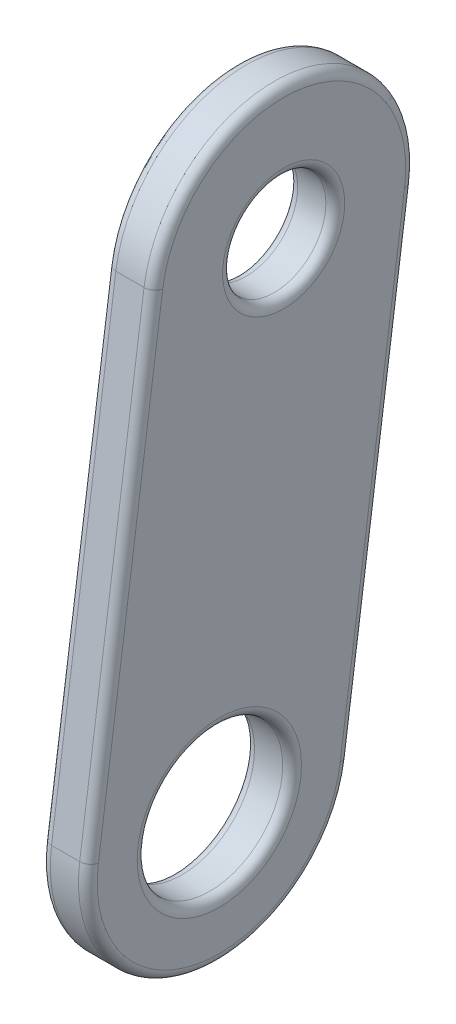
ISO-10303-21;
HEADER;
FILE_DESCRIPTION(('STEP AP214'),'2;1');
FILE_NAME('part.step','',(''),(''),'','','');
FILE_SCHEMA(('AUTOMOTIVE_DESIGN { 1 0 10303 214 1 1 1 1 }'));
ENDSEC;
DATA;
#1=APPLICATION_CONTEXT('core data for automotive mechanical design processes');
#2=APPLICATION_PROTOCOL_DEFINITION('international standard','automotive_design',2000,#1);
#3=PRODUCT_CONTEXT('',#1,'mechanical');
#4=PRODUCT('Part','Part','',(#3));
#5=PRODUCT_RELATED_PRODUCT_CATEGORY('part','',(#4));
#6=PRODUCT_DEFINITION_FORMATION('','',#4);
#7=PRODUCT_DEFINITION_CONTEXT('part definition',#1,'design');
#8=PRODUCT_DEFINITION('design','',#6,#7);
#9=PRODUCT_DEFINITION_SHAPE('','',#8);
#10=(LENGTH_UNIT() NAMED_UNIT(*) SI_UNIT(.MILLI.,.METRE.));
#11=(NAMED_UNIT(*) PLANE_ANGLE_UNIT() SI_UNIT($,.RADIAN.));
#12=(NAMED_UNIT(*) SI_UNIT($,.STERADIAN.) SOLID_ANGLE_UNIT());
#13=UNCERTAINTY_MEASURE_WITH_UNIT(LENGTH_MEASURE(1.E-05),#10,'distance_accuracy_value','');
#14=(GEOMETRIC_REPRESENTATION_CONTEXT(3) GLOBAL_UNCERTAINTY_ASSIGNED_CONTEXT((#13)) GLOBAL_UNIT_ASSIGNED_CONTEXT((#10,
#11,#12)) REPRESENTATION_CONTEXT('',''));
#15=CARTESIAN_POINT('',(0.,0.,0.));
#16=DIRECTION('',(0.,0.,1.));
#17=DIRECTION('',(1.,0.,0.));
#18=AXIS2_PLACEMENT_3D('',#15,#16,#17);
#19=CARTESIAN_POINT('',(2.5,-49.5285523713343,6.85));
#20=DIRECTION('',(-1.,0.,0.));
#21=DIRECTION('',(0.,0.,1.));
#22=AXIS2_PLACEMENT_3D('',#19,#20,#21);
#23=CYLINDRICAL_SURFACE('',#22,14.);
#24=DIRECTION('',(-1.,0.,0.));
#25=VECTOR('',#24,1.);
#26=CARTESIAN_POINT('',(2.5,-47.6105523713343,20.7179946639736));
#27=LINE('',#26,#25);
#28=CARTESIAN_POINT('',(1.5,-47.6105523713343,20.7179946639736));
#29=VERTEX_POINT('',#28);
#30=CARTESIAN_POINT('',(-1.5,-47.6105523713343,20.7179946639736));
#31=VERTEX_POINT('',#30);
#32=EDGE_CURVE('E162',#29,#31,#27,.T.);
#33=ORIENTED_EDGE('',*,*,#32,.T.);
#34=CARTESIAN_POINT('',(-1.5,-49.5285523713343,6.85));
#35=DIRECTION('',(1.,0.,0.));
#36=DIRECTION('',(0.,0.,-1.));
#37=AXIS2_PLACEMENT_3D('',#34,#35,#36);
#38=CIRCLE('',#37,14.);
#39=CARTESIAN_POINT('',(-1.5,-51.4465523713343,-7.0179946639736));
#40=VERTEX_POINT('',#39);
#41=EDGE_CURVE('E128',#31,#40,#38,.T.);
#42=ORIENTED_EDGE('',*,*,#41,.T.);
#43=DIRECTION('',(-1.,0.,0.));
#44=VECTOR('',#43,1.);
#45=CARTESIAN_POINT('',(2.5,-51.4465523713343,-7.0179946639736));
#46=LINE('',#45,#44);
#47=CARTESIAN_POINT('',(1.5,-51.4465523713343,-7.0179946639736));
#48=VERTEX_POINT('',#47);
#49=EDGE_CURVE('E113',#48,#40,#46,.T.);
#50=ORIENTED_EDGE('',*,*,#49,.F.);
#51=CARTESIAN_POINT('',(1.5,-49.5285523713343,6.85));
#52=DIRECTION('',(1.,0.,0.));
#53=DIRECTION('',(0.,0.,-1.));
#54=AXIS2_PLACEMENT_3D('',#51,#52,#53);
#55=CIRCLE('',#54,14.);
#56=EDGE_CURVE('E129',#48,#29,#55,.F.);
#57=ORIENTED_EDGE('',*,*,#56,.T.);
#58=EDGE_LOOP('',(#33,#42,#50,#57));
#59=FACE_BOUND('',#58,.T.);
#60=ADVANCED_FACE('F41',(#59),#23,.T.);
#61=CARTESIAN_POINT('',(2.5,-51.4465523713343,-7.0179946639736));
#62=DIRECTION('',(0.,0.137,0.990571047426685));
#63=DIRECTION('',(0.,-0.990571047426685,0.137));
#64=AXIS2_PLACEMENT_3D('',#61,#62,#63);
#65=PLANE('',#64);
#66=ORIENTED_EDGE('',*,*,#49,.T.);
#67=DIRECTION('',(0.,0.990571047426685,-0.137));
#68=VECTOR('',#67,1.);
#69=CARTESIAN_POINT('',(-1.5,-51.4465523713343,-7.0179946639736));
#70=LINE('',#69,#68);
#71=CARTESIAN_POINT('',(-1.5,-1.918,-13.8679946639736));
#72=VERTEX_POINT('',#71);
#73=EDGE_CURVE('E118',#40,#72,#70,.T.);
#74=ORIENTED_EDGE('',*,*,#73,.T.);
#75=DIRECTION('',(-1.,0.,0.));
#76=VECTOR('',#75,1.);
#77=CARTESIAN_POINT('',(2.5,-1.918,-13.8679946639736));
#78=LINE('',#77,#76);
#79=CARTESIAN_POINT('',(1.5,-1.918,-13.8679946639736));
#80=VERTEX_POINT('',#79);
#81=EDGE_CURVE('E114',#80,#72,#78,.T.);
#82=ORIENTED_EDGE('',*,*,#81,.F.);
#83=DIRECTION('',(0.,0.990571047426685,-0.137));
#84=VECTOR('',#83,1.);
#85=CARTESIAN_POINT('',(1.5,-51.4465523713343,-7.0179946639736));
#86=LINE('',#85,#84);
#87=EDGE_CURVE('E109',#80,#48,#86,.F.);
#88=ORIENTED_EDGE('',*,*,#87,.T.);
#89=EDGE_LOOP('',(#66,#74,#82,#88));
#90=FACE_BOUND('',#89,.T.);
#91=ADVANCED_FACE('F115',(#90),#65,.F.);
#92=CARTESIAN_POINT('',(2.5,0.,0.));
#93=DIRECTION('',(-1.,0.,0.));
#94=DIRECTION('',(0.,0.,1.));
#95=AXIS2_PLACEMENT_3D('',#92,#93,#94);
#96=CYLINDRICAL_SURFACE('',#95,14.);
#97=ORIENTED_EDGE('',*,*,#81,.T.);
#98=CARTESIAN_POINT('',(-1.5,0.,0.));
#99=DIRECTION('',(1.,0.,0.));
#100=DIRECTION('',(0.,0.,-1.));
#101=AXIS2_PLACEMENT_3D('',#98,#99,#100);
#102=CIRCLE('',#101,14.);
#103=CARTESIAN_POINT('',(-1.5,1.918,13.8679946639736));
#104=VERTEX_POINT('',#103);
#105=EDGE_CURVE('E191',#72,#104,#102,.T.);
#106=ORIENTED_EDGE('',*,*,#105,.T.);
#107=DIRECTION('',(-1.,0.,0.));
#108=VECTOR('',#107,1.);
#109=CARTESIAN_POINT('',(2.5,1.918,13.8679946639736));
#110=LINE('',#109,#108);
#111=CARTESIAN_POINT('',(1.5,1.918,13.8679946639736));
#112=VERTEX_POINT('',#111);
#113=EDGE_CURVE('E170',#112,#104,#110,.T.);
#114=ORIENTED_EDGE('',*,*,#113,.F.);
#115=CARTESIAN_POINT('',(1.5,0.,0.));
#116=DIRECTION('',(1.,0.,0.));
#117=DIRECTION('',(0.,0.,-1.));
#118=AXIS2_PLACEMENT_3D('',#115,#116,#117);
#119=CIRCLE('',#118,14.);
#120=EDGE_CURVE('E188',#112,#80,#119,.F.);
#121=ORIENTED_EDGE('',*,*,#120,.T.);
#122=EDGE_LOOP('',(#97,#106,#114,#121));
#123=FACE_BOUND('',#122,.T.);
#124=ADVANCED_FACE('F223',(#123),#96,.T.);
#125=CARTESIAN_POINT('',(2.5,-47.6105523713343,20.7179946639736));
#126=DIRECTION('',(0.,0.137,0.990571047426685));
#127=DIRECTION('',(0.,-0.990571047426685,0.137));
#128=AXIS2_PLACEMENT_3D('',#125,#126,#127);
#129=PLANE('',#128);
#130=ORIENTED_EDGE('',*,*,#113,.T.);
#131=DIRECTION('',(0.,0.990571047426685,-0.137));
#132=VECTOR('',#131,1.);
#133=CARTESIAN_POINT('',(-1.5,-47.6105523713343,20.7179946639736));
#134=LINE('',#133,#132);
#135=EDGE_CURVE('E11',#104,#31,#134,.F.);
#136=ORIENTED_EDGE('',*,*,#135,.T.);
#137=ORIENTED_EDGE('',*,*,#32,.F.);
#138=DIRECTION('',(0.,0.990571047426685,-0.137));
#139=VECTOR('',#138,1.);
#140=CARTESIAN_POINT('',(1.5,-47.6105523713343,20.7179946639736));
#141=LINE('',#140,#139);
#142=EDGE_CURVE('E49',#29,#112,#141,.T.);
#143=ORIENTED_EDGE('',*,*,#142,.T.);
#144=EDGE_LOOP('',(#130,#136,#137,#143));
#145=FACE_BOUND('',#144,.T.);
#146=ADVANCED_FACE('F219',(#145),#129,.T.);
#147=CARTESIAN_POINT('',(2.5,-49.5285523713343,6.85));
#148=DIRECTION('',(1.,0.,0.));
#149=DIRECTION('',(0.,0.,-1.));
#150=AXIS2_PLACEMENT_3D('',#147,#148,#149);
#151=PLANE('',#150);
#152=CARTESIAN_POINT('',(2.5,0.,0.));
#153=DIRECTION('',(1.,0.,0.));
#154=DIRECTION('',(0.,0.,-1.));
#155=AXIS2_PLACEMENT_3D('',#152,#153,#154);
#156=CIRCLE('',#155,6.49999999999999);
#157=CARTESIAN_POINT('',(2.5,0.,-6.49999999999999));
#158=VERTEX_POINT('',#157);
#159=EDGE_CURVE('E204',#158,#158,#156,.F.);
#160=ORIENTED_EDGE('',*,*,#159,.T.);
#161=EDGE_LOOP('',(#160));
#162=FACE_BOUND('',#161,.T.);
#163=CARTESIAN_POINT('',(2.5,-49.5285523713343,6.85));
#164=DIRECTION('',(1.,0.,0.));
#165=DIRECTION('',(0.,0.,-1.));
#166=AXIS2_PLACEMENT_3D('',#163,#164,#165);
#167=CIRCLE('',#166,8.75);
#168=CARTESIAN_POINT('',(2.5,-49.5285523713343,-1.9));
#169=VERTEX_POINT('',#168);
#170=EDGE_CURVE('E202',#169,#169,#167,.F.);
#171=ORIENTED_EDGE('',*,*,#170,.T.);
#172=EDGE_LOOP('',(#171));
#173=FACE_BOUND('',#172,.T.);
#174=DIRECTION('',(0.,0.990571047426685,-0.137));
#175=VECTOR('',#174,1.);
#176=CARTESIAN_POINT('',(2.5,-47.7475523713343,19.7274236165469));
#177=LINE('',#176,#175);
#178=CARTESIAN_POINT('',(2.5,1.781,12.8774236165469));
#179=VERTEX_POINT('',#178);
#180=CARTESIAN_POINT('',(2.5,-47.7475523713343,19.7274236165469));
#181=VERTEX_POINT('',#180);
#182=EDGE_CURVE('E193',#179,#181,#177,.F.);
#183=ORIENTED_EDGE('',*,*,#182,.T.);
#184=CARTESIAN_POINT('',(2.5,-49.5285523713343,6.85));
#185=DIRECTION('',(1.,0.,0.));
#186=DIRECTION('',(0.,0.,-1.));
#187=AXIS2_PLACEMENT_3D('',#184,#185,#186);
#188=CIRCLE('',#187,13.);
#189=CARTESIAN_POINT('',(2.5,-51.3095523713343,-6.02742361654691));
#190=VERTEX_POINT('',#189);
#191=EDGE_CURVE('E197',#181,#190,#188,.T.);
#192=ORIENTED_EDGE('',*,*,#191,.T.);
#193=DIRECTION('',(0.,0.990571047426685,-0.137));
#194=VECTOR('',#193,1.);
#195=CARTESIAN_POINT('',(2.5,-1.78099999999999,-12.8774236165469));
#196=LINE('',#195,#194);
#197=CARTESIAN_POINT('',(2.5,-1.781,-12.8774236165469));
#198=VERTEX_POINT('',#197);
#199=EDGE_CURVE('E62',#190,#198,#196,.T.);
#200=ORIENTED_EDGE('',*,*,#199,.T.);
#201=CARTESIAN_POINT('',(2.5,0.,0.));
#202=DIRECTION('',(1.,0.,0.));
#203=DIRECTION('',(0.,0.,-1.));
#204=AXIS2_PLACEMENT_3D('',#201,#202,#203);
#205=CIRCLE('',#204,13.);
#206=EDGE_CURVE('E196',#198,#179,#205,.T.);
#207=ORIENTED_EDGE('',*,*,#206,.T.);
#208=EDGE_LOOP('',(#183,#192,#200,#207));
#209=FACE_BOUND('',#208,.T.);
#210=ADVANCED_FACE('F227',(#162,#173,#209),#151,.T.);
#211=CARTESIAN_POINT('',(-2.5,-49.5285523713343,6.85));
#212=DIRECTION('',(1.,0.,0.));
#213=DIRECTION('',(0.,0.,-1.));
#214=AXIS2_PLACEMENT_3D('',#211,#212,#213);
#215=PLANE('',#214);
#216=CARTESIAN_POINT('',(-2.5,0.,0.));
#217=DIRECTION('',(1.,0.,0.));
#218=DIRECTION('',(0.,0.,-1.));
#219=AXIS2_PLACEMENT_3D('',#216,#217,#218);
#220=CIRCLE('',#219,6.49999999999999);
#221=CARTESIAN_POINT('',(-2.5,0.,-6.49999999999999));
#222=VERTEX_POINT('',#221);
#223=EDGE_CURVE('E119',#222,#222,#220,.T.);
#224=ORIENTED_EDGE('',*,*,#223,.T.);
#225=EDGE_LOOP('',(#224));
#226=FACE_BOUND('',#225,.T.);
#227=CARTESIAN_POINT('',(-2.5,-49.5285523713343,6.85));
#228=DIRECTION('',(1.,0.,0.));
#229=DIRECTION('',(0.,0.,-1.));
#230=AXIS2_PLACEMENT_3D('',#227,#228,#229);
#231=CIRCLE('',#230,8.75);
#232=CARTESIAN_POINT('',(-2.5,-49.5285523713343,-1.9));
#233=VERTEX_POINT('',#232);
#234=EDGE_CURVE('E183',#233,#233,#231,.T.);
#235=ORIENTED_EDGE('',*,*,#234,.T.);
#236=EDGE_LOOP('',(#235));
#237=FACE_BOUND('',#236,.T.);
#238=DIRECTION('',(0.,0.990571047426685,-0.137));
#239=VECTOR('',#238,1.);
#240=CARTESIAN_POINT('',(-2.5,-51.3095523713343,-6.02742361654691));
#241=LINE('',#240,#239);
#242=CARTESIAN_POINT('',(-2.5,-1.781,-12.8774236165469));
#243=VERTEX_POINT('',#242);
#244=CARTESIAN_POINT('',(-2.5,-51.3095523713343,-6.02742361654691));
#245=VERTEX_POINT('',#244);
#246=EDGE_CURVE('E177',#243,#245,#241,.F.);
#247=ORIENTED_EDGE('',*,*,#246,.T.);
#248=CARTESIAN_POINT('',(-2.5,-49.5285523713343,6.85));
#249=DIRECTION('',(1.,0.,0.));
#250=DIRECTION('',(0.,0.,-1.));
#251=AXIS2_PLACEMENT_3D('',#248,#249,#250);
#252=CIRCLE('',#251,13.);
#253=CARTESIAN_POINT('',(-2.5,-47.7475523713343,19.7274236165469));
#254=VERTEX_POINT('',#253);
#255=EDGE_CURVE('E181',#245,#254,#252,.F.);
#256=ORIENTED_EDGE('',*,*,#255,.T.);
#257=DIRECTION('',(0.,0.990571047426685,-0.137));
#258=VECTOR('',#257,1.);
#259=CARTESIAN_POINT('',(-2.5,1.781,12.8774236165469));
#260=LINE('',#259,#258);
#261=CARTESIAN_POINT('',(-2.5,1.781,12.8774236165469));
#262=VERTEX_POINT('',#261);
#263=EDGE_CURVE('E174',#254,#262,#260,.T.);
#264=ORIENTED_EDGE('',*,*,#263,.T.);
#265=CARTESIAN_POINT('',(-2.5,0.,0.));
#266=DIRECTION('',(1.,0.,0.));
#267=DIRECTION('',(0.,0.,-1.));
#268=AXIS2_PLACEMENT_3D('',#265,#266,#267);
#269=CIRCLE('',#268,13.);
#270=EDGE_CURVE('E180',#262,#243,#269,.F.);
#271=ORIENTED_EDGE('',*,*,#270,.T.);
#272=EDGE_LOOP('',(#247,#256,#264,#271));
#273=FACE_BOUND('',#272,.T.);
#274=ADVANCED_FACE('F288',(#226,#237,#273),#215,.F.);
#275=CARTESIAN_POINT('',(2.5,-49.5285523713343,6.85));
#276=DIRECTION('',(1.,0.,0.));
#277=DIRECTION('',(0.,0.,-1.));
#278=AXIS2_PLACEMENT_3D('',#275,#276,#277);
#279=CYLINDRICAL_SURFACE('',#278,7.75);
#280=CARTESIAN_POINT('',(1.5,-49.5285523713343,6.85));
#281=DIRECTION('',(1.,0.,0.));
#282=DIRECTION('',(0.,0.,-1.));
#283=AXIS2_PLACEMENT_3D('',#280,#281,#282);
#284=CIRCLE('',#283,7.75);
#285=CARTESIAN_POINT('',(1.5,-49.5285523713343,-0.900000000000001));
#286=VERTEX_POINT('',#285);
#287=EDGE_CURVE('E216',#286,#286,#284,.T.);
#288=ORIENTED_EDGE('',*,*,#287,.T.);
#289=EDGE_LOOP('',(#288));
#290=FACE_BOUND('',#289,.T.);
#291=CARTESIAN_POINT('',(-1.5,-49.5285523713343,6.85));
#292=DIRECTION('',(1.,0.,0.));
#293=DIRECTION('',(0.,0.,-1.));
#294=AXIS2_PLACEMENT_3D('',#291,#292,#293);
#295=CIRCLE('',#294,7.75);
#296=CARTESIAN_POINT('',(-1.5,-49.5285523713343,-0.900000000000001));
#297=VERTEX_POINT('',#296);
#298=EDGE_CURVE('E215',#297,#297,#295,.F.);
#299=ORIENTED_EDGE('',*,*,#298,.T.);
#300=EDGE_LOOP('',(#299));
#301=FACE_BOUND('',#300,.T.);
#302=ADVANCED_FACE('F284',(#290,#301),#279,.F.);
#303=CARTESIAN_POINT('',(2.5,0.,0.));
#304=DIRECTION('',(1.,0.,0.));
#305=DIRECTION('',(0.,0.,-1.));
#306=AXIS2_PLACEMENT_3D('',#303,#304,#305);
#307=CYLINDRICAL_SURFACE('',#306,5.49999999999999);
#308=CARTESIAN_POINT('',(-1.5,0.,0.));
#309=DIRECTION('',(1.,0.,0.));
#310=DIRECTION('',(0.,0.,-1.));
#311=AXIS2_PLACEMENT_3D('',#308,#309,#310);
#312=CIRCLE('',#311,5.49999999999999);
#313=CARTESIAN_POINT('',(-1.5,0.,-5.49999999999999));
#314=VERTEX_POINT('',#313);
#315=EDGE_CURVE('E208',#314,#314,#312,.F.);
#316=ORIENTED_EDGE('',*,*,#315,.T.);
#317=EDGE_LOOP('',(#316));
#318=FACE_BOUND('',#317,.T.);
#319=CARTESIAN_POINT('',(1.5,0.,0.));
#320=DIRECTION('',(1.,0.,0.));
#321=DIRECTION('',(0.,0.,-1.));
#322=AXIS2_PLACEMENT_3D('',#319,#320,#321);
#323=CIRCLE('',#322,5.49999999999999);
#324=CARTESIAN_POINT('',(1.5,0.,-5.49999999999999));
#325=VERTEX_POINT('',#324);
#326=EDGE_CURVE('E210',#325,#325,#323,.T.);
#327=ORIENTED_EDGE('',*,*,#326,.T.);
#328=EDGE_LOOP('',(#327));
#329=FACE_BOUND('',#328,.T.);
#330=ADVANCED_FACE('F256',(#318,#329),#307,.F.);
#331=CARTESIAN_POINT('',(-1.5,0.,0.));
#332=DIRECTION('',(1.,0.,0.));
#333=DIRECTION('',(0.,0.,-1.));
#334=AXIS2_PLACEMENT_3D('',#331,#332,#333);
#335=TOROIDAL_SURFACE('',#334,13.,1.);
#336=CARTESIAN_POINT('',(-1.5,-1.781,-12.8774236165469));
#337=DIRECTION('',(0.,-0.990571047426685,0.137));
#338=DIRECTION('',(0.,-0.137,-0.990571047426685));
#339=AXIS2_PLACEMENT_3D('',#336,#337,#338);
#340=CIRCLE('',#339,1.);
#341=EDGE_CURVE('E152',#243,#72,#340,.T.);
#342=ORIENTED_EDGE('',*,*,#341,.F.);
#343=ORIENTED_EDGE('',*,*,#270,.F.);
#344=CARTESIAN_POINT('',(-1.5,1.781,12.8774236165469));
#345=DIRECTION('',(0.,-0.990571047426685,0.137));
#346=DIRECTION('',(0.,-0.137,-0.990571047426685));
#347=AXIS2_PLACEMENT_3D('',#344,#345,#346);
#348=CIRCLE('',#347,1.);
#349=EDGE_CURVE('E142',#104,#262,#348,.T.);
#350=ORIENTED_EDGE('',*,*,#349,.F.);
#351=ORIENTED_EDGE('',*,*,#105,.F.);
#352=EDGE_LOOP('',(#342,#343,#350,#351));
#353=FACE_BOUND('',#352,.T.);
#354=ADVANCED_FACE('F251',(#353),#335,.T.);
#355=CARTESIAN_POINT('',(-1.5,-47.7475523713343,19.7274236165469));
#356=DIRECTION('',(0.,-0.990571047426685,0.137));
#357=DIRECTION('',(0.,-0.137,-0.990571047426685));
#358=AXIS2_PLACEMENT_3D('',#355,#356,#357);
#359=CYLINDRICAL_SURFACE('',#358,1.);
#360=ORIENTED_EDGE('',*,*,#349,.T.);
#361=ORIENTED_EDGE('',*,*,#263,.F.);
#362=CARTESIAN_POINT('',(-1.5,-47.7475523713343,19.7274236165469));
#363=DIRECTION('',(0.,-0.990571047426685,0.136999999999998));
#364=DIRECTION('',(0.,-0.136999999999998,-0.990571047426685));
#365=AXIS2_PLACEMENT_3D('',#362,#363,#364);
#366=CIRCLE('',#365,1.);
#367=EDGE_CURVE('E150',#31,#254,#366,.T.);
#368=ORIENTED_EDGE('',*,*,#367,.F.);
#369=ORIENTED_EDGE('',*,*,#135,.F.);
#370=EDGE_LOOP('',(#360,#361,#368,#369));
#371=FACE_BOUND('',#370,.T.);
#372=ADVANCED_FACE('F252',(#371),#359,.T.);
#373=CARTESIAN_POINT('',(-1.5,-51.3095523713343,-6.02742361654691));
#374=DIRECTION('',(0.,0.990571047426685,-0.137));
#375=DIRECTION('',(0.,0.137,0.990571047426685));
#376=AXIS2_PLACEMENT_3D('',#373,#374,#375);
#377=CYLINDRICAL_SURFACE('',#376,1.);
#378=ORIENTED_EDGE('',*,*,#341,.T.);
#379=ORIENTED_EDGE('',*,*,#73,.F.);
#380=CARTESIAN_POINT('',(-1.5,-51.3095523713343,-6.02742361654691));
#381=DIRECTION('',(0.,-0.990571047426685,0.136999999999998));
#382=DIRECTION('',(0.,-0.136999999999998,-0.990571047426685));
#383=AXIS2_PLACEMENT_3D('',#380,#381,#382);
#384=CIRCLE('',#383,1.);
#385=EDGE_CURVE('E144',#245,#40,#384,.T.);
#386=ORIENTED_EDGE('',*,*,#385,.F.);
#387=ORIENTED_EDGE('',*,*,#246,.F.);
#388=EDGE_LOOP('',(#378,#379,#386,#387));
#389=FACE_BOUND('',#388,.T.);
#390=ADVANCED_FACE('F247',(#389),#377,.T.);
#391=CARTESIAN_POINT('',(-1.5,-49.5285523713343,6.85));
#392=DIRECTION('',(1.,0.,0.));
#393=DIRECTION('',(0.,0.,-1.));
#394=AXIS2_PLACEMENT_3D('',#391,#392,#393);
#395=TOROIDAL_SURFACE('',#394,13.,1.);
#396=ORIENTED_EDGE('',*,*,#367,.T.);
#397=ORIENTED_EDGE('',*,*,#255,.F.);
#398=ORIENTED_EDGE('',*,*,#385,.T.);
#399=ORIENTED_EDGE('',*,*,#41,.F.);
#400=EDGE_LOOP('',(#396,#397,#398,#399));
#401=FACE_BOUND('',#400,.T.);
#402=ADVANCED_FACE('F236',(#401),#395,.T.);
#403=CARTESIAN_POINT('',(1.5,0.,0.));
#404=DIRECTION('',(1.,0.,0.));
#405=DIRECTION('',(0.,0.,-1.));
#406=AXIS2_PLACEMENT_3D('',#403,#404,#405);
#407=TOROIDAL_SURFACE('',#406,13.,1.);
#408=CARTESIAN_POINT('',(1.5,-1.781,-12.8774236165469));
#409=DIRECTION('',(0.,-0.990571047426685,0.137));
#410=DIRECTION('',(0.,-0.137,-0.990571047426685));
#411=AXIS2_PLACEMENT_3D('',#408,#409,#410);
#412=CIRCLE('',#411,1.);
#413=EDGE_CURVE('E138',#80,#198,#412,.T.);
#414=ORIENTED_EDGE('',*,*,#413,.F.);
#415=ORIENTED_EDGE('',*,*,#120,.F.);
#416=CARTESIAN_POINT('',(1.5,1.781,12.8774236165469));
#417=DIRECTION('',(0.,-0.990571047426685,0.137));
#418=DIRECTION('',(0.,-0.137,-0.990571047426685));
#419=AXIS2_PLACEMENT_3D('',#416,#417,#418);
#420=CIRCLE('',#419,1.);
#421=EDGE_CURVE('E44',#179,#112,#420,.T.);
#422=ORIENTED_EDGE('',*,*,#421,.F.);
#423=ORIENTED_EDGE('',*,*,#206,.F.);
#424=EDGE_LOOP('',(#414,#415,#422,#423));
#425=FACE_BOUND('',#424,.T.);
#426=ADVANCED_FACE('F228',(#425),#407,.T.);
#427=CARTESIAN_POINT('',(1.5,-47.7475523713343,19.7274236165469));
#428=DIRECTION('',(0.,0.990571047426685,-0.137));
#429=DIRECTION('',(0.,0.137,0.990571047426685));
#430=AXIS2_PLACEMENT_3D('',#427,#428,#429);
#431=CYLINDRICAL_SURFACE('',#430,1.);
#432=ORIENTED_EDGE('',*,*,#421,.T.);
#433=ORIENTED_EDGE('',*,*,#142,.F.);
#434=CARTESIAN_POINT('',(1.5,-47.7475523713343,19.7274236165469));
#435=DIRECTION('',(0.,-0.990571047426685,0.136999999999998));
#436=DIRECTION('',(0.,-0.136999999999998,-0.990571047426685));
#437=AXIS2_PLACEMENT_3D('',#434,#435,#436);
#438=CIRCLE('',#437,1.);
#439=EDGE_CURVE('E133',#181,#29,#438,.T.);
#440=ORIENTED_EDGE('',*,*,#439,.F.);
#441=ORIENTED_EDGE('',*,*,#182,.F.);
#442=EDGE_LOOP('',(#432,#433,#440,#441));
#443=FACE_BOUND('',#442,.T.);
#444=ADVANCED_FACE('F226',(#443),#431,.T.);
#445=CARTESIAN_POINT('',(1.5,-51.3095523713343,-6.02742361654691));
#446=DIRECTION('',(0.,-0.990571047426685,0.137));
#447=DIRECTION('',(0.,-0.137,-0.990571047426685));
#448=AXIS2_PLACEMENT_3D('',#445,#446,#447);
#449=CYLINDRICAL_SURFACE('',#448,1.);
#450=ORIENTED_EDGE('',*,*,#413,.T.);
#451=ORIENTED_EDGE('',*,*,#199,.F.);
#452=CARTESIAN_POINT('',(1.5,-51.3095523713343,-6.02742361654691));
#453=DIRECTION('',(0.,-0.990571047426685,0.136999999999998));
#454=DIRECTION('',(0.,-0.136999999999998,-0.990571047426685));
#455=AXIS2_PLACEMENT_3D('',#452,#453,#454);
#456=CIRCLE('',#455,1.);
#457=EDGE_CURVE('E59',#48,#190,#456,.T.);
#458=ORIENTED_EDGE('',*,*,#457,.F.);
#459=ORIENTED_EDGE('',*,*,#87,.F.);
#460=EDGE_LOOP('',(#450,#451,#458,#459));
#461=FACE_BOUND('',#460,.T.);
#462=ADVANCED_FACE('F137',(#461),#449,.T.);
#463=CARTESIAN_POINT('',(1.5,-49.5285523713343,6.85));
#464=DIRECTION('',(1.,0.,0.));
#465=DIRECTION('',(0.,0.,-1.));
#466=AXIS2_PLACEMENT_3D('',#463,#464,#465);
#467=TOROIDAL_SURFACE('',#466,13.,1.);
#468=ORIENTED_EDGE('',*,*,#439,.T.);
#469=ORIENTED_EDGE('',*,*,#56,.F.);
#470=ORIENTED_EDGE('',*,*,#457,.T.);
#471=ORIENTED_EDGE('',*,*,#191,.F.);
#472=EDGE_LOOP('',(#468,#469,#470,#471));
#473=FACE_BOUND('',#472,.T.);
#474=ADVANCED_FACE('F131',(#473),#467,.T.);
#475=CARTESIAN_POINT('',(-1.5,0.,0.));
#476=DIRECTION('',(1.,0.,0.));
#477=DIRECTION('',(0.,0.,-1.));
#478=AXIS2_PLACEMENT_3D('',#475,#476,#477);
#479=TOROIDAL_SURFACE('',#478,6.49999999999999,1.);
#480=ORIENTED_EDGE('',*,*,#315,.F.);
#481=EDGE_LOOP('',(#480));
#482=FACE_BOUND('',#481,.T.);
#483=ORIENTED_EDGE('',*,*,#223,.F.);
#484=EDGE_LOOP('',(#483));
#485=FACE_BOUND('',#484,.T.);
#486=ADVANCED_FACE('F257',(#482,#485),#479,.T.);
#487=CARTESIAN_POINT('',(1.5,0.,0.));
#488=DIRECTION('',(1.,0.,0.));
#489=DIRECTION('',(0.,0.,-1.));
#490=AXIS2_PLACEMENT_3D('',#487,#488,#489);
#491=TOROIDAL_SURFACE('',#490,6.49999999999999,1.);
#492=ORIENTED_EDGE('',*,*,#159,.F.);
#493=EDGE_LOOP('',(#492));
#494=FACE_BOUND('',#493,.T.);
#495=ORIENTED_EDGE('',*,*,#326,.F.);
#496=EDGE_LOOP('',(#495));
#497=FACE_BOUND('',#496,.T.);
#498=ADVANCED_FACE('F262',(#494,#497),#491,.T.);
#499=CARTESIAN_POINT('',(1.5,-49.5285523713343,6.85));
#500=DIRECTION('',(1.,0.,0.));
#501=DIRECTION('',(0.,0.,-1.));
#502=AXIS2_PLACEMENT_3D('',#499,#500,#501);
#503=TOROIDAL_SURFACE('',#502,8.75,1.);
#504=ORIENTED_EDGE('',*,*,#170,.F.);
#505=EDGE_LOOP('',(#504));
#506=FACE_BOUND('',#505,.T.);
#507=ORIENTED_EDGE('',*,*,#287,.F.);
#508=EDGE_LOOP('',(#507));
#509=FACE_BOUND('',#508,.T.);
#510=ADVANCED_FACE('F266',(#506,#509),#503,.T.);
#511=CARTESIAN_POINT('',(-1.5,-49.5285523713343,6.85));
#512=DIRECTION('',(1.,0.,0.));
#513=DIRECTION('',(0.,0.,-1.));
#514=AXIS2_PLACEMENT_3D('',#511,#512,#513);
#515=TOROIDAL_SURFACE('',#514,8.75,1.);
#516=ORIENTED_EDGE('',*,*,#298,.F.);
#517=EDGE_LOOP('',(#516));
#518=FACE_BOUND('',#517,.T.);
#519=ORIENTED_EDGE('',*,*,#234,.F.);
#520=EDGE_LOOP('',(#519));
#521=FACE_BOUND('',#520,.T.);
#522=ADVANCED_FACE('F43',(#518,#521),#515,.T.);
#523=CLOSED_SHELL('',(#60,#91,#124,#146,#210,#274,#302,#330,#354,#372,#390,#402,#426,#444,#462,
#474,#486,#498,#510,#522));
#524=MANIFOLD_SOLID_BREP('B2',#523);
#525=ADVANCED_BREP_SHAPE_REPRESENTATION('',(#18,#524),#14);
#526=SHAPE_DEFINITION_REPRESENTATION(#9,#525);
ENDSEC;
END-ISO-10303-21;
